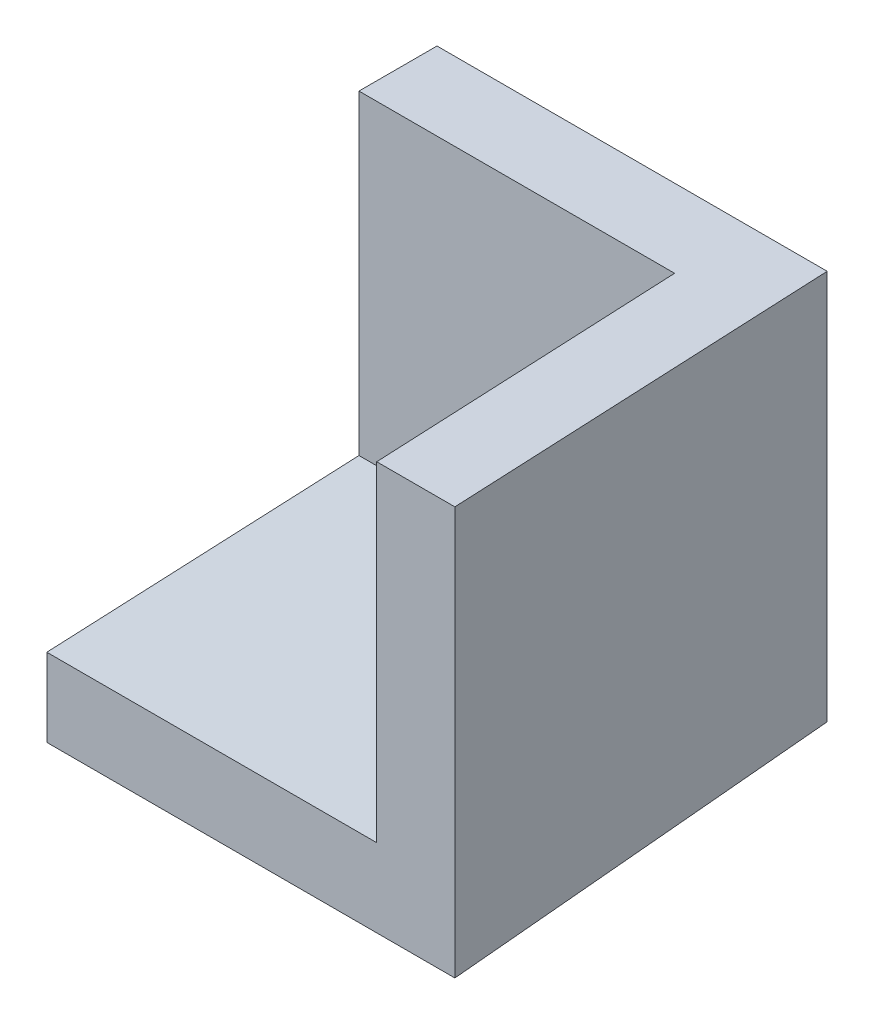
ISO-10303-21;
HEADER;
FILE_DESCRIPTION(('STEP AP214'),'2;1');
FILE_NAME('part.step','',(''),(''),'','','');
FILE_SCHEMA(('AUTOMOTIVE_DESIGN { 1 0 10303 214 1 1 1 1 }'));
ENDSEC;
DATA;
#1=APPLICATION_CONTEXT('core data for automotive mechanical design processes');
#2=APPLICATION_PROTOCOL_DEFINITION('international standard','automotive_design',2000,#1);
#3=PRODUCT_CONTEXT('',#1,'mechanical');
#4=PRODUCT('Part','Part','',(#3));
#5=PRODUCT_RELATED_PRODUCT_CATEGORY('part','',(#4));
#6=PRODUCT_DEFINITION_FORMATION('','',#4);
#7=PRODUCT_DEFINITION_CONTEXT('part definition',#1,'design');
#8=PRODUCT_DEFINITION('design','',#6,#7);
#9=PRODUCT_DEFINITION_SHAPE('','',#8);
#10=(LENGTH_UNIT() NAMED_UNIT(*) SI_UNIT(.MILLI.,.METRE.));
#11=(NAMED_UNIT(*) PLANE_ANGLE_UNIT() SI_UNIT($,.RADIAN.));
#12=(NAMED_UNIT(*) SI_UNIT($,.STERADIAN.) SOLID_ANGLE_UNIT());
#13=UNCERTAINTY_MEASURE_WITH_UNIT(LENGTH_MEASURE(1.E-05),#10,'distance_accuracy_value','');
#14=(GEOMETRIC_REPRESENTATION_CONTEXT(3) GLOBAL_UNCERTAINTY_ASSIGNED_CONTEXT((#13)) GLOBAL_UNIT_ASSIGNED_CONTEXT((#10,
#11,#12)) REPRESENTATION_CONTEXT('',''));
#15=CARTESIAN_POINT('',(0.,0.,0.));
#16=DIRECTION('',(0.,0.,1.));
#17=DIRECTION('',(1.,0.,0.));
#18=AXIS2_PLACEMENT_3D('',#15,#16,#17);
#19=CARTESIAN_POINT('',(192.5,112.5,50.000025));
#20=DIRECTION('',(1.,0.,0.));
#21=DIRECTION('',(0.,0.,-1.));
#22=AXIS2_PLACEMENT_3D('',#19,#20,#21);
#23=PLANE('',#22);
#24=DIRECTION('',(0.,-1.,0.));
#25=VECTOR('',#24,1.);
#26=CARTESIAN_POINT('',(192.5,112.5,10.));
#27=LINE('',#26,#25);
#28=CARTESIAN_POINT('',(192.5,112.5,10.));
#29=VERTEX_POINT('',#28);
#30=CARTESIAN_POINT('',(192.5,72.0528015217391,10.));
#31=VERTEX_POINT('',#30);
#32=EDGE_CURVE('E109',#29,#31,#27,.T.);
#33=ORIENTED_EDGE('',*,*,#32,.F.);
#34=DIRECTION('',(0.,0.,-1.));
#35=VECTOR('',#34,1.);
#36=CARTESIAN_POINT('',(192.5,112.5,50.000025));
#37=LINE('',#36,#35);
#38=CARTESIAN_POINT('',(192.5,112.5,0.));
#39=VERTEX_POINT('',#38);
#40=EDGE_CURVE('E134',#29,#39,#37,.T.);
#41=ORIENTED_EDGE('',*,*,#40,.T.);
#42=DIRECTION('',(0.,-1.,0.));
#43=VECTOR('',#42,1.);
#44=CARTESIAN_POINT('',(192.5,112.5,0.));
#45=LINE('',#44,#43);
#46=CARTESIAN_POINT('',(192.5,62.5,0.));
#47=VERTEX_POINT('',#46);
#48=EDGE_CURVE('E131',#39,#47,#45,.T.);
#49=ORIENTED_EDGE('',*,*,#48,.T.);
#50=DIRECTION('',(0.,0.0457187346435417,-0.998954351961386));
#51=VECTOR('',#50,1.);
#52=CARTESIAN_POINT('',(192.5,62.3693623314121,2.85443305864587));
#53=LINE('',#52,#51);
#54=CARTESIAN_POINT('',(192.5,60.2116704805492,50.));
#55=VERTEX_POINT('',#54);
#56=EDGE_CURVE('E126',#55,#47,#53,.T.);
#57=ORIENTED_EDGE('',*,*,#56,.F.);
#58=DIRECTION('',(0.,1.,0.));
#59=VECTOR('',#58,1.);
#60=CARTESIAN_POINT('',(192.5,0.,50.));
#61=LINE('',#60,#59);
#62=CARTESIAN_POINT('',(192.5,70.2221379061784,50.));
#63=VERTEX_POINT('',#62);
#64=EDGE_CURVE('E138',#55,#63,#61,.T.);
#65=ORIENTED_EDGE('',*,*,#64,.T.);
#66=DIRECTION('',(0.,0.0457187346435418,-0.998954351961386));
#67=VECTOR('',#66,1.);
#68=CARTESIAN_POINT('',(192.5,72.358905851026,3.31162040508128));
#69=LINE('',#68,#67);
#70=EDGE_CURVE('E50',#63,#31,#69,.T.);
#71=ORIENTED_EDGE('',*,*,#70,.T.);
#72=EDGE_LOOP('',(#33,#41,#49,#57,#65,#71));
#73=FACE_BOUND('',#72,.T.);
#74=ADVANCED_FACE('F33',(#73),#23,.F.);
#75=CARTESIAN_POINT('',(0.,62.3693623314121,2.85443305864586));
#76=DIRECTION('',(0.,0.998954351961386,0.0457187346435418));
#77=DIRECTION('',(0.,-0.0457187346435418,0.998954351961386));
#78=AXIS2_PLACEMENT_3D('',#75,#76,#77);
#79=PLANE('',#78);
#80=DIRECTION('',(1.,0.,0.));
#81=VECTOR('',#80,1.);
#82=CARTESIAN_POINT('',(0.,60.2116704805492,50.));
#83=LINE('',#82,#81);
#84=CARTESIAN_POINT('',(244.788329519451,60.2116704805492,50.));
#85=VERTEX_POINT('',#84);
#86=EDGE_CURVE('E147',#55,#85,#83,.T.);
#87=ORIENTED_EDGE('',*,*,#86,.F.);
#88=ORIENTED_EDGE('',*,*,#56,.T.);
#89=DIRECTION('',(-1.,0.,0.));
#90=VECTOR('',#89,1.);
#91=CARTESIAN_POINT('',(242.5,62.5,0.));
#92=LINE('',#91,#90);
#93=CARTESIAN_POINT('',(242.5,62.5,0.));
#94=VERTEX_POINT('',#93);
#95=EDGE_CURVE('E11',#94,#47,#92,.T.);
#96=ORIENTED_EDGE('',*,*,#95,.F.);
#97=DIRECTION('',(0.0456710287056021,-0.0456710287056019,0.997911977217402));
#98=VECTOR('',#97,1.);
#99=CARTESIAN_POINT('',(242.5,62.5,0.));
#100=LINE('',#99,#98);
#101=EDGE_CURVE('E146',#94,#85,#100,.T.);
#102=ORIENTED_EDGE('',*,*,#101,.T.);
#103=EDGE_LOOP('',(#87,#88,#96,#102));
#104=FACE_BOUND('',#103,.T.);
#105=ADVANCED_FACE('F167',(#104),#79,.F.);
#106=CARTESIAN_POINT('',(0.,0.,0.));
#107=DIRECTION('',(0.,0.,1.));
#108=DIRECTION('',(1.,0.,0.));
#109=AXIS2_PLACEMENT_3D('',#106,#107,#108);
#110=PLANE('',#109);
#111=ORIENTED_EDGE('',*,*,#95,.T.);
#112=ORIENTED_EDGE('',*,*,#48,.F.);
#113=DIRECTION('',(-1.,0.,0.));
#114=VECTOR('',#113,1.);
#115=CARTESIAN_POINT('',(192.5,112.5,0.));
#116=LINE('',#115,#114);
#117=CARTESIAN_POINT('',(242.5,112.5,0.));
#118=VERTEX_POINT('',#117);
#119=EDGE_CURVE('E128',#118,#39,#116,.T.);
#120=ORIENTED_EDGE('',*,*,#119,.F.);
#121=DIRECTION('',(0.,-1.,0.));
#122=VECTOR('',#121,1.);
#123=CARTESIAN_POINT('',(242.5,242.5,0.));
#124=LINE('',#123,#122);
#125=EDGE_CURVE('E37',#118,#94,#124,.T.);
#126=ORIENTED_EDGE('',*,*,#125,.T.);
#127=EDGE_LOOP('',(#111,#112,#120,#126));
#128=FACE_BOUND('',#127,.T.);
#129=ADVANCED_FACE('F163',(#128),#110,.F.);
#130=CARTESIAN_POINT('',(241.993125845879,1.0333320773658E-13,-11.075200267546));
#131=DIRECTION('',(-0.998954351961386,0.,0.0457187346435417));
#132=DIRECTION('',(0.0457187346435417,0.,0.998954351961386));
#133=AXIS2_PLACEMENT_3D('',#130,#131,#132);
#134=PLANE('',#133);
#135=ORIENTED_EDGE('',*,*,#125,.F.);
#136=DIRECTION('',(0.0457187346435417,0.,0.998954351961386));
#137=VECTOR('',#136,1.);
#138=CARTESIAN_POINT('',(241.993125845879,112.5,-11.0752002675459));
#139=LINE('',#138,#137);
#140=CARTESIAN_POINT('',(244.788329519451,112.5,50.));
#141=VERTEX_POINT('',#140);
#142=EDGE_CURVE('E110',#118,#141,#139,.T.);
#143=ORIENTED_EDGE('',*,*,#142,.T.);
#144=DIRECTION('',(0.,1.,0.));
#145=VECTOR('',#144,1.);
#146=CARTESIAN_POINT('',(244.788329519451,1.04526784458471E-13,50.));
#147=LINE('',#146,#145);
#148=EDGE_CURVE('E141',#85,#141,#147,.T.);
#149=ORIENTED_EDGE('',*,*,#148,.F.);
#150=ORIENTED_EDGE('',*,*,#101,.F.);
#151=EDGE_LOOP('',(#135,#143,#149,#150));
#152=FACE_BOUND('',#151,.T.);
#153=ADVANCED_FACE('F35',(#152),#134,.F.);
#154=CARTESIAN_POINT('',(192.5,112.5,50.000025));
#155=DIRECTION('',(0.,-1.,0.));
#156=DIRECTION('',(1.,0.,0.));
#157=AXIS2_PLACEMENT_3D('',#154,#155,#156);
#158=PLANE('',#157);
#159=DIRECTION('',(-1.,0.,0.));
#160=VECTOR('',#159,1.);
#161=CARTESIAN_POINT('',(192.5,112.5,10.));
#162=LINE('',#161,#160);
#163=CARTESIAN_POINT('',(232.947198478261,112.5,10.));
#164=VERTEX_POINT('',#163);
#165=EDGE_CURVE('E120',#164,#29,#162,.T.);
#166=ORIENTED_EDGE('',*,*,#165,.F.);
#167=DIRECTION('',(0.0457187346435417,0.,0.998954351961386));
#168=VECTOR('',#167,1.);
#169=CARTESIAN_POINT('',(232.003582326265,112.5,-10.6180129211105));
#170=LINE('',#169,#168);
#171=CARTESIAN_POINT('',(234.777862093822,112.5,50.));
#172=VERTEX_POINT('',#171);
#173=EDGE_CURVE('E102',#164,#172,#170,.T.);
#174=ORIENTED_EDGE('',*,*,#173,.T.);
#175=DIRECTION('',(1.,0.,0.));
#176=VECTOR('',#175,1.);
#177=CARTESIAN_POINT('',(0.,112.5,50.));
#178=LINE('',#177,#176);
#179=EDGE_CURVE('E136',#172,#141,#178,.T.);
#180=ORIENTED_EDGE('',*,*,#179,.T.);
#181=ORIENTED_EDGE('',*,*,#142,.F.);
#182=ORIENTED_EDGE('',*,*,#119,.T.);
#183=ORIENTED_EDGE('',*,*,#40,.F.);
#184=EDGE_LOOP('',(#166,#174,#180,#181,#182,#183));
#185=FACE_BOUND('',#184,.T.);
#186=ADVANCED_FACE('F160',(#185),#158,.F.);
#187=CARTESIAN_POINT('',(0.,0.,50.));
#188=DIRECTION('',(0.,0.,1.));
#189=DIRECTION('',(1.,0.,0.));
#190=AXIS2_PLACEMENT_3D('',#187,#188,#189);
#191=PLANE('',#190);
#192=DIRECTION('',(0.,1.,0.));
#193=VECTOR('',#192,1.);
#194=CARTESIAN_POINT('',(234.777862093822,1.00252226218781E-13,50.));
#195=LINE('',#194,#193);
#196=CARTESIAN_POINT('',(234.777862093822,70.2221379061784,50.));
#197=VERTEX_POINT('',#196);
#198=EDGE_CURVE('E115',#197,#172,#195,.T.);
#199=ORIENTED_EDGE('',*,*,#198,.F.);
#200=DIRECTION('',(1.,0.,0.));
#201=VECTOR('',#200,1.);
#202=CARTESIAN_POINT('',(0.,70.2221379061784,50.));
#203=LINE('',#202,#201);
#204=EDGE_CURVE('E113',#63,#197,#203,.T.);
#205=ORIENTED_EDGE('',*,*,#204,.F.);
#206=ORIENTED_EDGE('',*,*,#64,.F.);
#207=ORIENTED_EDGE('',*,*,#86,.T.);
#208=ORIENTED_EDGE('',*,*,#148,.T.);
#209=ORIENTED_EDGE('',*,*,#179,.F.);
#210=EDGE_LOOP('',(#199,#205,#206,#207,#208,#209));
#211=FACE_BOUND('',#210,.T.);
#212=ADVANCED_FACE('F154',(#211),#191,.T.);
#213=CARTESIAN_POINT('',(0.,72.358905851026,3.31162040508128));
#214=DIRECTION('',(0.,0.998954351961386,0.0457187346435418));
#215=DIRECTION('',(0.,-0.0457187346435418,0.998954351961386));
#216=AXIS2_PLACEMENT_3D('',#213,#214,#215);
#217=PLANE('',#216);
#218=ORIENTED_EDGE('',*,*,#204,.T.);
#219=DIRECTION('',(0.0456710287056019,-0.0456710287056019,0.997911977217402));
#220=VECTOR('',#219,1.);
#221=CARTESIAN_POINT('',(232.155841383096,72.8441586169036,-7.29115252934521));
#222=LINE('',#221,#220);
#223=CARTESIAN_POINT('',(232.947198478261,72.0528015217391,10.));
#224=VERTEX_POINT('',#223);
#225=EDGE_CURVE('E99',#224,#197,#222,.T.);
#226=ORIENTED_EDGE('',*,*,#225,.F.);
#227=DIRECTION('',(-1.,0.,0.));
#228=VECTOR('',#227,1.);
#229=CARTESIAN_POINT('',(0.,72.0528015217391,10.));
#230=LINE('',#229,#228);
#231=EDGE_CURVE('E105',#224,#31,#230,.T.);
#232=ORIENTED_EDGE('',*,*,#231,.T.);
#233=ORIENTED_EDGE('',*,*,#70,.F.);
#234=EDGE_LOOP('',(#218,#226,#232,#233));
#235=FACE_BOUND('',#234,.T.);
#236=ADVANCED_FACE('F112',(#235),#217,.T.);
#237=CARTESIAN_POINT('',(0.,0.,10.));
#238=DIRECTION('',(0.,0.,1.));
#239=DIRECTION('',(1.,0.,0.));
#240=AXIS2_PLACEMENT_3D('',#237,#238,#239);
#241=PLANE('',#240);
#242=ORIENTED_EDGE('',*,*,#231,.F.);
#243=DIRECTION('',(0.,-1.,0.));
#244=VECTOR('',#243,1.);
#245=CARTESIAN_POINT('',(232.947198478261,0.,10.));
#246=LINE('',#245,#244);
#247=EDGE_CURVE('E95',#164,#224,#246,.T.);
#248=ORIENTED_EDGE('',*,*,#247,.F.);
#249=ORIENTED_EDGE('',*,*,#165,.T.);
#250=ORIENTED_EDGE('',*,*,#32,.T.);
#251=EDGE_LOOP('',(#242,#248,#249,#250));
#252=FACE_BOUND('',#251,.T.);
#253=ADVANCED_FACE('F107',(#252),#241,.T.);
#254=CARTESIAN_POINT('',(232.003582326265,0.,-10.6180129211105));
#255=DIRECTION('',(-0.998954351961386,0.,0.0457187346435417));
#256=DIRECTION('',(0.0457187346435417,0.,0.998954351961386));
#257=AXIS2_PLACEMENT_3D('',#254,#255,#256);
#258=PLANE('',#257);
#259=ORIENTED_EDGE('',*,*,#247,.T.);
#260=ORIENTED_EDGE('',*,*,#225,.T.);
#261=ORIENTED_EDGE('',*,*,#198,.T.);
#262=ORIENTED_EDGE('',*,*,#173,.F.);
#263=EDGE_LOOP('',(#259,#260,#261,#262));
#264=FACE_BOUND('',#263,.T.);
#265=ADVANCED_FACE('F97',(#264),#258,.T.);
#266=CLOSED_SHELL('',(#74,#105,#129,#153,#186,#212,#236,#253,#265));
#267=MANIFOLD_SOLID_BREP('B2',#266);
#268=ADVANCED_BREP_SHAPE_REPRESENTATION('',(#18,#267),#14);
#269=SHAPE_DEFINITION_REPRESENTATION(#9,#268);
ENDSEC;
END-ISO-10303-21;
